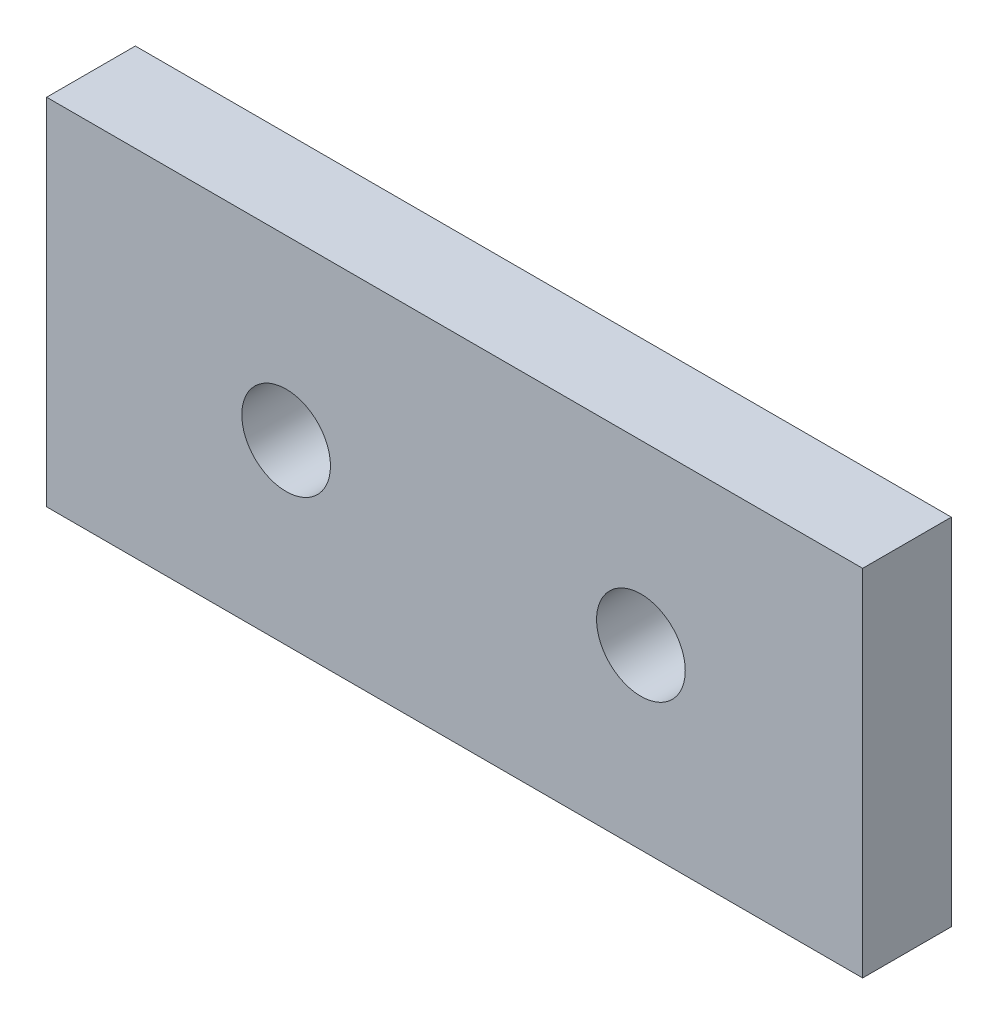
ISO-10303-21;
HEADER;
FILE_DESCRIPTION(('STEP AP214'),'2;1');
FILE_NAME('part.step','',(''),(''),'','','');
FILE_SCHEMA(('AUTOMOTIVE_DESIGN { 1 0 10303 214 1 1 1 1 }'));
ENDSEC;
DATA;
#1=APPLICATION_CONTEXT('core data for automotive mechanical design processes');
#2=APPLICATION_PROTOCOL_DEFINITION('international standard','automotive_design',2000,#1);
#3=PRODUCT_CONTEXT('',#1,'mechanical');
#4=PRODUCT('Part','Part','',(#3));
#5=PRODUCT_RELATED_PRODUCT_CATEGORY('part','',(#4));
#6=PRODUCT_DEFINITION_FORMATION('','',#4);
#7=PRODUCT_DEFINITION_CONTEXT('part definition',#1,'design');
#8=PRODUCT_DEFINITION('design','',#6,#7);
#9=PRODUCT_DEFINITION_SHAPE('','',#8);
#10=(LENGTH_UNIT() NAMED_UNIT(*) SI_UNIT(.MILLI.,.METRE.));
#11=(NAMED_UNIT(*) PLANE_ANGLE_UNIT() SI_UNIT($,.RADIAN.));
#12=(NAMED_UNIT(*) SI_UNIT($,.STERADIAN.) SOLID_ANGLE_UNIT());
#13=UNCERTAINTY_MEASURE_WITH_UNIT(LENGTH_MEASURE(1.E-05),#10,'distance_accuracy_value','');
#14=(GEOMETRIC_REPRESENTATION_CONTEXT(3) GLOBAL_UNCERTAINTY_ASSIGNED_CONTEXT((#13)) GLOBAL_UNIT_ASSIGNED_CONTEXT((#10,
#11,#12)) REPRESENTATION_CONTEXT('',''));
#15=CARTESIAN_POINT('',(0.,0.,0.));
#16=DIRECTION('',(0.,0.,1.));
#17=DIRECTION('',(1.,0.,0.));
#18=AXIS2_PLACEMENT_3D('',#15,#16,#17);
#19=CARTESIAN_POINT('',(0.,0.,10.));
#20=DIRECTION('',(0.,0.,1.));
#21=DIRECTION('',(1.,0.,0.));
#22=AXIS2_PLACEMENT_3D('',#19,#20,#21);
#23=PLANE('',#22);
#24=CARTESIAN_POINT('',(21.,0.,10.));
#25=DIRECTION('',(0.,0.,1.));
#26=DIRECTION('',(1.,0.,0.));
#27=AXIS2_PLACEMENT_3D('',#24,#25,#26);
#28=CIRCLE('',#27,5.);
#29=CARTESIAN_POINT('',(26.,0.,10.));
#30=VERTEX_POINT('',#29);
#31=EDGE_CURVE('E112',#30,#30,#28,.T.);
#32=ORIENTED_EDGE('',*,*,#31,.F.);
#33=EDGE_LOOP('',(#32));
#34=FACE_BOUND('',#33,.T.);
#35=DIRECTION('',(0.,1.,0.));
#36=VECTOR('',#35,1.);
#37=CARTESIAN_POINT('',(46.,20.,10.));
#38=LINE('',#37,#36);
#39=CARTESIAN_POINT('',(46.,-20.,10.));
#40=VERTEX_POINT('',#39);
#41=CARTESIAN_POINT('',(46.,20.,10.));
#42=VERTEX_POINT('',#41);
#43=EDGE_CURVE('E92',#40,#42,#38,.T.);
#44=ORIENTED_EDGE('',*,*,#43,.T.);
#45=DIRECTION('',(-1.,0.,0.));
#46=VECTOR('',#45,1.);
#47=CARTESIAN_POINT('',(-46.,20.,10.));
#48=LINE('',#47,#46);
#49=CARTESIAN_POINT('',(-46.,20.,10.));
#50=VERTEX_POINT('',#49);
#51=EDGE_CURVE('E87',#42,#50,#48,.T.);
#52=ORIENTED_EDGE('',*,*,#51,.T.);
#53=DIRECTION('',(0.,-1.,0.));
#54=VECTOR('',#53,1.);
#55=CARTESIAN_POINT('',(-46.,20.,10.));
#56=LINE('',#55,#54);
#57=CARTESIAN_POINT('',(-46.,-20.,10.));
#58=VERTEX_POINT('',#57);
#59=EDGE_CURVE('E90',#50,#58,#56,.T.);
#60=ORIENTED_EDGE('',*,*,#59,.T.);
#61=DIRECTION('',(1.,0.,0.));
#62=VECTOR('',#61,1.);
#63=CARTESIAN_POINT('',(-46.,-20.,10.));
#64=LINE('',#63,#62);
#65=EDGE_CURVE('E57',#58,#40,#64,.T.);
#66=ORIENTED_EDGE('',*,*,#65,.T.);
#67=EDGE_LOOP('',(#44,#52,#60,#66));
#68=FACE_BOUND('',#67,.T.);
#69=CARTESIAN_POINT('',(-19.,0.,10.));
#70=DIRECTION('',(0.,0.,1.));
#71=DIRECTION('',(1.,0.,0.));
#72=AXIS2_PLACEMENT_3D('',#69,#70,#71);
#73=CIRCLE('',#72,5.);
#74=CARTESIAN_POINT('',(-14.,0.,10.));
#75=VERTEX_POINT('',#74);
#76=EDGE_CURVE('E134',#75,#75,#73,.T.);
#77=ORIENTED_EDGE('',*,*,#76,.F.);
#78=EDGE_LOOP('',(#77));
#79=FACE_BOUND('',#78,.T.);
#80=ADVANCED_FACE('F39',(#34,#68,#79),#23,.T.);
#81=CARTESIAN_POINT('',(0.,0.,0.));
#82=DIRECTION('',(0.,0.,1.));
#83=DIRECTION('',(1.,0.,0.));
#84=AXIS2_PLACEMENT_3D('',#81,#82,#83);
#85=PLANE('',#84);
#86=DIRECTION('',(0.,1.,0.));
#87=VECTOR('',#86,1.);
#88=CARTESIAN_POINT('',(46.,20.,0.));
#89=LINE('',#88,#87);
#90=CARTESIAN_POINT('',(46.,-20.,0.));
#91=VERTEX_POINT('',#90);
#92=CARTESIAN_POINT('',(46.,20.,0.));
#93=VERTEX_POINT('',#92);
#94=EDGE_CURVE('E108',#91,#93,#89,.T.);
#95=ORIENTED_EDGE('',*,*,#94,.F.);
#96=DIRECTION('',(1.,0.,0.));
#97=VECTOR('',#96,1.);
#98=CARTESIAN_POINT('',(-46.,-20.,0.));
#99=LINE('',#98,#97);
#100=CARTESIAN_POINT('',(-46.,-20.,0.));
#101=VERTEX_POINT('',#100);
#102=EDGE_CURVE('E80',#101,#91,#99,.T.);
#103=ORIENTED_EDGE('',*,*,#102,.F.);
#104=DIRECTION('',(0.,-1.,0.));
#105=VECTOR('',#104,1.);
#106=CARTESIAN_POINT('',(-46.,20.,0.));
#107=LINE('',#106,#105);
#108=CARTESIAN_POINT('',(-46.,20.,0.));
#109=VERTEX_POINT('',#108);
#110=EDGE_CURVE('E74',#109,#101,#107,.T.);
#111=ORIENTED_EDGE('',*,*,#110,.F.);
#112=DIRECTION('',(-1.,0.,0.));
#113=VECTOR('',#112,1.);
#114=CARTESIAN_POINT('',(-46.,20.,0.));
#115=LINE('',#114,#113);
#116=EDGE_CURVE('E97',#93,#109,#115,.T.);
#117=ORIENTED_EDGE('',*,*,#116,.F.);
#118=EDGE_LOOP('',(#95,#103,#111,#117));
#119=FACE_BOUND('',#118,.T.);
#120=CARTESIAN_POINT('',(21.,0.,0.));
#121=DIRECTION('',(0.,0.,1.));
#122=DIRECTION('',(1.,0.,0.));
#123=AXIS2_PLACEMENT_3D('',#120,#121,#122);
#124=CIRCLE('',#123,5.);
#125=CARTESIAN_POINT('',(26.,0.,0.));
#126=VERTEX_POINT('',#125);
#127=EDGE_CURVE('E130',#126,#126,#124,.T.);
#128=ORIENTED_EDGE('',*,*,#127,.T.);
#129=EDGE_LOOP('',(#128));
#130=FACE_BOUND('',#129,.T.);
#131=CARTESIAN_POINT('',(-19.,0.,0.));
#132=DIRECTION('',(0.,0.,1.));
#133=DIRECTION('',(1.,0.,0.));
#134=AXIS2_PLACEMENT_3D('',#131,#132,#133);
#135=CIRCLE('',#134,5.);
#136=CARTESIAN_POINT('',(-14.,0.,0.));
#137=VERTEX_POINT('',#136);
#138=EDGE_CURVE('E138',#137,#137,#135,.T.);
#139=ORIENTED_EDGE('',*,*,#138,.T.);
#140=EDGE_LOOP('',(#139));
#141=FACE_BOUND('',#140,.T.);
#142=ADVANCED_FACE('F125',(#119,#130,#141),#85,.F.);
#143=CARTESIAN_POINT('',(46.,20.,10.));
#144=DIRECTION('',(-1.,0.,0.));
#145=DIRECTION('',(0.,0.,1.));
#146=AXIS2_PLACEMENT_3D('',#143,#144,#145);
#147=PLANE('',#146);
#148=ORIENTED_EDGE('',*,*,#94,.T.);
#149=DIRECTION('',(0.,0.,-1.));
#150=VECTOR('',#149,1.);
#151=CARTESIAN_POINT('',(46.,20.,10.));
#152=LINE('',#151,#150);
#153=EDGE_CURVE('E11',#42,#93,#152,.T.);
#154=ORIENTED_EDGE('',*,*,#153,.F.);
#155=ORIENTED_EDGE('',*,*,#43,.F.);
#156=DIRECTION('',(0.,0.,-1.));
#157=VECTOR('',#156,1.);
#158=CARTESIAN_POINT('',(46.,-20.,10.));
#159=LINE('',#158,#157);
#160=EDGE_CURVE('E104',#40,#91,#159,.T.);
#161=ORIENTED_EDGE('',*,*,#160,.T.);
#162=EDGE_LOOP('',(#148,#154,#155,#161));
#163=FACE_BOUND('',#162,.T.);
#164=ADVANCED_FACE('F41',(#163),#147,.F.);
#165=CARTESIAN_POINT('',(-46.,20.,10.));
#166=DIRECTION('',(0.,-1.,0.));
#167=DIRECTION('',(0.,0.,-1.));
#168=AXIS2_PLACEMENT_3D('',#165,#166,#167);
#169=PLANE('',#168);
#170=ORIENTED_EDGE('',*,*,#116,.T.);
#171=DIRECTION('',(0.,0.,-1.));
#172=VECTOR('',#171,1.);
#173=CARTESIAN_POINT('',(-46.,20.,10.));
#174=LINE('',#173,#172);
#175=EDGE_CURVE('E49',#50,#109,#174,.T.);
#176=ORIENTED_EDGE('',*,*,#175,.F.);
#177=ORIENTED_EDGE('',*,*,#51,.F.);
#178=ORIENTED_EDGE('',*,*,#153,.T.);
#179=EDGE_LOOP('',(#170,#176,#177,#178));
#180=FACE_BOUND('',#179,.T.);
#181=ADVANCED_FACE('F96',(#180),#169,.F.);
#182=CARTESIAN_POINT('',(-46.,20.,10.));
#183=DIRECTION('',(1.,0.,0.));
#184=DIRECTION('',(0.,0.,-1.));
#185=AXIS2_PLACEMENT_3D('',#182,#183,#184);
#186=PLANE('',#185);
#187=ORIENTED_EDGE('',*,*,#110,.T.);
#188=DIRECTION('',(0.,0.,-1.));
#189=VECTOR('',#188,1.);
#190=CARTESIAN_POINT('',(-46.,-20.,10.));
#191=LINE('',#190,#189);
#192=EDGE_CURVE('E99',#58,#101,#191,.T.);
#193=ORIENTED_EDGE('',*,*,#192,.F.);
#194=ORIENTED_EDGE('',*,*,#59,.F.);
#195=ORIENTED_EDGE('',*,*,#175,.T.);
#196=EDGE_LOOP('',(#187,#193,#194,#195));
#197=FACE_BOUND('',#196,.T.);
#198=ADVANCED_FACE('F100',(#197),#186,.F.);
#199=CARTESIAN_POINT('',(-46.,-20.,10.));
#200=DIRECTION('',(0.,1.,0.));
#201=DIRECTION('',(0.,0.,1.));
#202=AXIS2_PLACEMENT_3D('',#199,#200,#201);
#203=PLANE('',#202);
#204=ORIENTED_EDGE('',*,*,#102,.T.);
#205=ORIENTED_EDGE('',*,*,#160,.F.);
#206=ORIENTED_EDGE('',*,*,#65,.F.);
#207=ORIENTED_EDGE('',*,*,#192,.T.);
#208=EDGE_LOOP('',(#204,#205,#206,#207));
#209=FACE_BOUND('',#208,.T.);
#210=ADVANCED_FACE('F122',(#209),#203,.F.);
#211=CARTESIAN_POINT('',(21.,0.,10.));
#212=DIRECTION('',(0.,0.,-1.));
#213=DIRECTION('',(-1.,0.,0.));
#214=AXIS2_PLACEMENT_3D('',#211,#212,#213);
#215=CYLINDRICAL_SURFACE('',#214,5.);
#216=ORIENTED_EDGE('',*,*,#31,.T.);
#217=EDGE_LOOP('',(#216));
#218=FACE_BOUND('',#217,.T.);
#219=ORIENTED_EDGE('',*,*,#127,.F.);
#220=EDGE_LOOP('',(#219));
#221=FACE_BOUND('',#220,.T.);
#222=ADVANCED_FACE('F157',(#218,#221),#215,.F.);
#223=CARTESIAN_POINT('',(-19.,0.,10.));
#224=DIRECTION('',(0.,0.,-1.));
#225=DIRECTION('',(-1.,0.,0.));
#226=AXIS2_PLACEMENT_3D('',#223,#224,#225);
#227=CYLINDRICAL_SURFACE('',#226,5.);
#228=ORIENTED_EDGE('',*,*,#76,.T.);
#229=EDGE_LOOP('',(#228));
#230=FACE_BOUND('',#229,.T.);
#231=ORIENTED_EDGE('',*,*,#138,.F.);
#232=EDGE_LOOP('',(#231));
#233=FACE_BOUND('',#232,.T.);
#234=ADVANCED_FACE('F146',(#230,#233),#227,.F.);
#235=CLOSED_SHELL('',(#80,#142,#164,#181,#198,#210,#222,#234));
#236=MANIFOLD_SOLID_BREP('B2',#235);
#237=ADVANCED_BREP_SHAPE_REPRESENTATION('',(#18,#236),#14);
#238=SHAPE_DEFINITION_REPRESENTATION(#9,#237);
ENDSEC;
END-ISO-10303-21;
